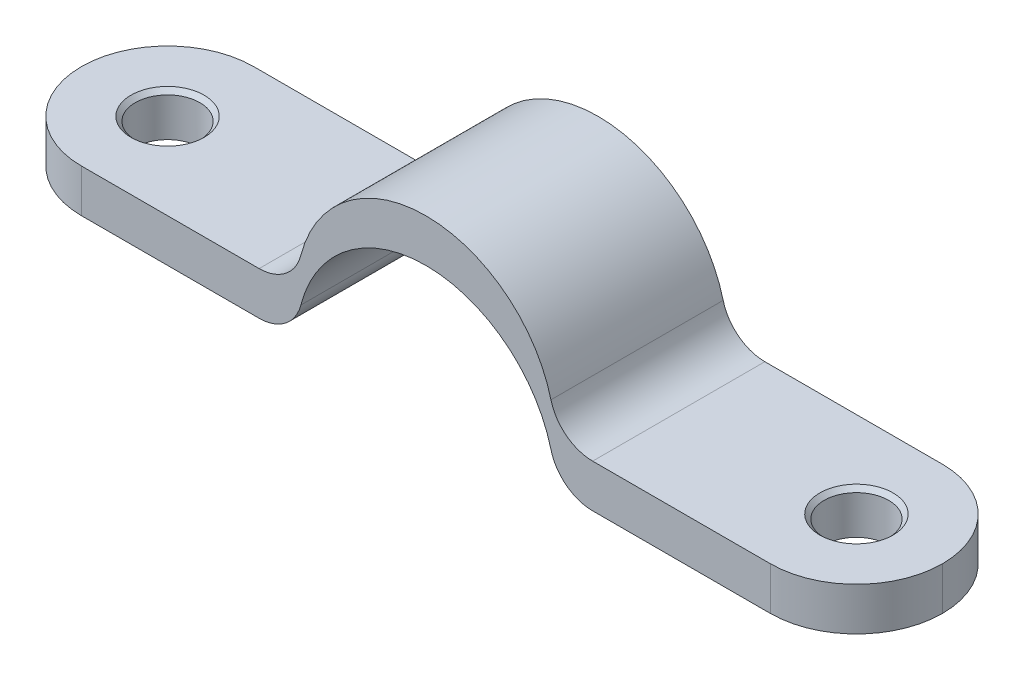
ISO-10303-21;
HEADER;
FILE_DESCRIPTION(('STEP AP214'),'2;1');
FILE_NAME('part.step','',(''),(''),'','','');
FILE_SCHEMA(('AUTOMOTIVE_DESIGN { 1 0 10303 214 1 1 1 1 }'));
ENDSEC;
DATA;
#1=APPLICATION_CONTEXT('core data for automotive mechanical design processes');
#2=APPLICATION_PROTOCOL_DEFINITION('international standard','automotive_design',2000,#1);
#3=PRODUCT_CONTEXT('',#1,'mechanical');
#4=PRODUCT('Part','Part','',(#3));
#5=PRODUCT_RELATED_PRODUCT_CATEGORY('part','',(#4));
#6=PRODUCT_DEFINITION_FORMATION('','',#4);
#7=PRODUCT_DEFINITION_CONTEXT('part definition',#1,'design');
#8=PRODUCT_DEFINITION('design','',#6,#7);
#9=PRODUCT_DEFINITION_SHAPE('','',#8);
#10=(LENGTH_UNIT() NAMED_UNIT(*) SI_UNIT(.MILLI.,.METRE.));
#11=(NAMED_UNIT(*) PLANE_ANGLE_UNIT() SI_UNIT($,.RADIAN.));
#12=(NAMED_UNIT(*) SI_UNIT($,.STERADIAN.) SOLID_ANGLE_UNIT());
#13=UNCERTAINTY_MEASURE_WITH_UNIT(LENGTH_MEASURE(1.E-05),#10,'distance_accuracy_value','');
#14=(GEOMETRIC_REPRESENTATION_CONTEXT(3) GLOBAL_UNCERTAINTY_ASSIGNED_CONTEXT((#13)) GLOBAL_UNIT_ASSIGNED_CONTEXT((#10,
#11,#12)) REPRESENTATION_CONTEXT('',''));
#15=CARTESIAN_POINT('',(0.,0.,0.));
#16=DIRECTION('',(0.,0.,1.));
#17=DIRECTION('',(1.,0.,0.));
#18=AXIS2_PLACEMENT_3D('',#15,#16,#17);
#19=CARTESIAN_POINT('',(-38.7298334620741,4.99999999999999,40.));
#20=DIRECTION('',(0.,-1.,0.));
#21=DIRECTION('',(1.,0.,0.));
#22=AXIS2_PLACEMENT_3D('',#19,#20,#21);
#23=PLANE('',#22);
#24=CARTESIAN_POINT('',(-80.,4.99999999999999,20.));
#25=DIRECTION('',(0.,-1.,0.));
#26=DIRECTION('',(1.,0.,0.));
#27=AXIS2_PLACEMENT_3D('',#24,#25,#26);
#28=CIRCLE('',#27,8.49999999999999);
#29=CARTESIAN_POINT('',(-71.5,4.99999999999999,20.));
#30=VERTEX_POINT('',#29);
#31=EDGE_CURVE('E11',#30,#30,#28,.T.);
#32=ORIENTED_EDGE('',*,*,#31,.T.);
#33=EDGE_LOOP('',(#32));
#34=FACE_BOUND('',#33,.T.);
#35=DIRECTION('',(-1.,0.,0.));
#36=VECTOR('',#35,1.);
#37=CARTESIAN_POINT('',(-38.7298334620741,4.99999999999999,0.));
#38=LINE('',#37,#36);
#39=CARTESIAN_POINT('',(-38.7298334620741,4.99999999999999,0.));
#40=VERTEX_POINT('',#39);
#41=CARTESIAN_POINT('',(-80.,4.99999999999999,0.));
#42=VERTEX_POINT('',#41);
#43=EDGE_CURVE('E179',#40,#42,#38,.T.);
#44=ORIENTED_EDGE('',*,*,#43,.T.);
#45=CARTESIAN_POINT('',(-80.,4.99999999999999,20.));
#46=DIRECTION('',(0.,-1.,0.));
#47=DIRECTION('',(1.,0.,0.));
#48=AXIS2_PLACEMENT_3D('',#45,#46,#47);
#49=CIRCLE('',#48,20.);
#50=CARTESIAN_POINT('',(-100.,4.99999999999999,20.));
#51=VERTEX_POINT('',#50);
#52=EDGE_CURVE('E51',#42,#51,#49,.F.);
#53=ORIENTED_EDGE('',*,*,#52,.T.);
#54=CARTESIAN_POINT('',(-80.,4.99999999999999,20.));
#55=DIRECTION('',(0.,-1.,0.));
#56=DIRECTION('',(1.,0.,0.));
#57=AXIS2_PLACEMENT_3D('',#54,#55,#56);
#58=CIRCLE('',#57,20.);
#59=CARTESIAN_POINT('',(-80.,4.99999999999999,40.));
#60=VERTEX_POINT('',#59);
#61=EDGE_CURVE('E237',#51,#60,#58,.F.);
#62=ORIENTED_EDGE('',*,*,#61,.T.);
#63=DIRECTION('',(-1.,0.,0.));
#64=VECTOR('',#63,1.);
#65=CARTESIAN_POINT('',(-38.7298334620741,4.99999999999999,40.));
#66=LINE('',#65,#64);
#67=CARTESIAN_POINT('',(-38.7298334620741,4.99999999999999,40.));
#68=VERTEX_POINT('',#67);
#69=EDGE_CURVE('E146',#68,#60,#66,.T.);
#70=ORIENTED_EDGE('',*,*,#69,.F.);
#71=DIRECTION('',(0.,0.,-1.));
#72=VECTOR('',#71,1.);
#73=CARTESIAN_POINT('',(-38.7298334620741,4.99999999999999,40.));
#74=LINE('',#73,#72);
#75=EDGE_CURVE('E178',#68,#40,#74,.T.);
#76=ORIENTED_EDGE('',*,*,#75,.T.);
#77=EDGE_LOOP('',(#44,#53,#62,#70,#76));
#78=FACE_BOUND('',#77,.T.);
#79=ADVANCED_FACE('F35',(#34,#78),#23,.F.);
#80=CARTESIAN_POINT('',(-38.7298334620741,-5.,40.));
#81=DIRECTION('',(0.,1.,0.));
#82=DIRECTION('',(-1.,0.,0.));
#83=AXIS2_PLACEMENT_3D('',#80,#81,#82);
#84=PLANE('',#83);
#85=CARTESIAN_POINT('',(-80.,-5.00000000000001,20.));
#86=DIRECTION('',(0.,1.,0.));
#87=DIRECTION('',(-1.,0.,0.));
#88=AXIS2_PLACEMENT_3D('',#85,#86,#87);
#89=CIRCLE('',#88,7.5);
#90=CARTESIAN_POINT('',(-87.5,-5.00000000000001,20.));
#91=VERTEX_POINT('',#90);
#92=EDGE_CURVE('E246',#91,#91,#89,.T.);
#93=ORIENTED_EDGE('',*,*,#92,.T.);
#94=EDGE_LOOP('',(#93));
#95=FACE_BOUND('',#94,.T.);
#96=CARTESIAN_POINT('',(-80.,-5.00000000000001,20.));
#97=DIRECTION('',(0.,1.,0.));
#98=DIRECTION('',(-1.,0.,0.));
#99=AXIS2_PLACEMENT_3D('',#96,#97,#98);
#100=CIRCLE('',#99,20.);
#101=CARTESIAN_POINT('',(-80.,-5.00000000000001,40.));
#102=VERTEX_POINT('',#101);
#103=CARTESIAN_POINT('',(-100.,-5.00000000000001,20.));
#104=VERTEX_POINT('',#103);
#105=EDGE_CURVE('E59',#102,#104,#100,.F.);
#106=ORIENTED_EDGE('',*,*,#105,.T.);
#107=CARTESIAN_POINT('',(-80.,-5.00000000000001,20.));
#108=DIRECTION('',(0.,1.,0.));
#109=DIRECTION('',(-1.,0.,0.));
#110=AXIS2_PLACEMENT_3D('',#107,#108,#109);
#111=CIRCLE('',#110,20.);
#112=CARTESIAN_POINT('',(-80.,-5.00000000000001,0.));
#113=VERTEX_POINT('',#112);
#114=EDGE_CURVE('E235',#104,#113,#111,.F.);
#115=ORIENTED_EDGE('',*,*,#114,.T.);
#116=DIRECTION('',(1.,0.,0.));
#117=VECTOR('',#116,1.);
#118=CARTESIAN_POINT('',(-38.7298334620741,-5.,0.));
#119=LINE('',#118,#117);
#120=CARTESIAN_POINT('',(-38.7298334620741,-5.,0.));
#121=VERTEX_POINT('',#120);
#122=EDGE_CURVE('E152',#113,#121,#119,.T.);
#123=ORIENTED_EDGE('',*,*,#122,.T.);
#124=DIRECTION('',(0.,0.,-1.));
#125=VECTOR('',#124,1.);
#126=CARTESIAN_POINT('',(-38.7298334620741,-5.,40.));
#127=LINE('',#126,#125);
#128=CARTESIAN_POINT('',(-38.7298334620741,-5.,40.));
#129=VERTEX_POINT('',#128);
#130=EDGE_CURVE('E149',#129,#121,#127,.T.);
#131=ORIENTED_EDGE('',*,*,#130,.F.);
#132=DIRECTION('',(1.,0.,0.));
#133=VECTOR('',#132,1.);
#134=CARTESIAN_POINT('',(-38.7298334620741,-5.,40.));
#135=LINE('',#134,#133);
#136=EDGE_CURVE('E136',#102,#129,#135,.T.);
#137=ORIENTED_EDGE('',*,*,#136,.F.);
#138=EDGE_LOOP('',(#106,#115,#123,#131,#137));
#139=FACE_BOUND('',#138,.T.);
#140=ADVANCED_FACE('F150',(#95,#139),#84,.F.);
#141=CARTESIAN_POINT('',(-38.7298334620741,4.99999999999999,40.));
#142=DIRECTION('',(0.,0.,-1.));
#143=DIRECTION('',(-1.,0.,0.));
#144=AXIS2_PLACEMENT_3D('',#141,#142,#143);
#145=CYLINDRICAL_SURFACE('',#144,10.);
#146=CARTESIAN_POINT('',(-38.7298334620741,4.99999999999999,0.));
#147=DIRECTION('',(0.,0.,1.));
#148=DIRECTION('',(-1.,0.,0.));
#149=AXIS2_PLACEMENT_3D('',#146,#147,#148);
#150=CIRCLE('',#149,10.);
#151=CARTESIAN_POINT('',(-29.0473750965556,2.5,0.));
#152=VERTEX_POINT('',#151);
#153=EDGE_CURVE('E183',#121,#152,#150,.T.);
#154=ORIENTED_EDGE('',*,*,#153,.T.);
#155=DIRECTION('',(0.,0.,-1.));
#156=VECTOR('',#155,1.);
#157=CARTESIAN_POINT('',(-29.0473750965556,2.5,40.));
#158=LINE('',#157,#156);
#159=CARTESIAN_POINT('',(-29.0473750965556,2.5,40.));
#160=VERTEX_POINT('',#159);
#161=EDGE_CURVE('E156',#160,#152,#158,.T.);
#162=ORIENTED_EDGE('',*,*,#161,.F.);
#163=CARTESIAN_POINT('',(-38.7298334620741,4.99999999999999,40.));
#164=DIRECTION('',(0.,0.,1.));
#165=DIRECTION('',(-1.,0.,0.));
#166=AXIS2_PLACEMENT_3D('',#163,#164,#165);
#167=CIRCLE('',#166,10.);
#168=EDGE_CURVE('E141',#129,#160,#167,.T.);
#169=ORIENTED_EDGE('',*,*,#168,.F.);
#170=ORIENTED_EDGE('',*,*,#130,.T.);
#171=EDGE_LOOP('',(#154,#162,#169,#170));
#172=FACE_BOUND('',#171,.T.);
#173=ADVANCED_FACE('F158',(#172),#145,.T.);
#174=CARTESIAN_POINT('',(0.,-5.,40.));
#175=DIRECTION('',(0.,0.,-1.));
#176=DIRECTION('',(-1.,0.,0.));
#177=AXIS2_PLACEMENT_3D('',#174,#175,#176);
#178=CYLINDRICAL_SURFACE('',#177,30.);
#179=CARTESIAN_POINT('',(0.,-5.,0.));
#180=DIRECTION('',(0.,0.,-1.));
#181=DIRECTION('',(1.,0.,0.));
#182=AXIS2_PLACEMENT_3D('',#179,#180,#181);
#183=CIRCLE('',#182,30.);
#184=CARTESIAN_POINT('',(29.0473750965556,2.50000000000002,0.));
#185=VERTEX_POINT('',#184);
#186=EDGE_CURVE('E185',#152,#185,#183,.T.);
#187=ORIENTED_EDGE('',*,*,#186,.T.);
#188=DIRECTION('',(0.,0.,-1.));
#189=VECTOR('',#188,1.);
#190=CARTESIAN_POINT('',(29.0473750965556,2.50000000000002,40.));
#191=LINE('',#190,#189);
#192=CARTESIAN_POINT('',(29.0473750965556,2.50000000000002,40.));
#193=VERTEX_POINT('',#192);
#194=EDGE_CURVE('E214',#193,#185,#191,.T.);
#195=ORIENTED_EDGE('',*,*,#194,.F.);
#196=CARTESIAN_POINT('',(0.,-5.,40.));
#197=DIRECTION('',(0.,0.,-1.));
#198=DIRECTION('',(1.,0.,0.));
#199=AXIS2_PLACEMENT_3D('',#196,#197,#198);
#200=CIRCLE('',#199,30.);
#201=EDGE_CURVE('E161',#160,#193,#200,.T.);
#202=ORIENTED_EDGE('',*,*,#201,.F.);
#203=ORIENTED_EDGE('',*,*,#161,.T.);
#204=EDGE_LOOP('',(#187,#195,#202,#203));
#205=FACE_BOUND('',#204,.T.);
#206=ADVANCED_FACE('F310',(#205),#178,.F.);
#207=CARTESIAN_POINT('',(38.7298334620742,5.00000000000002,40.));
#208=DIRECTION('',(0.,0.,-1.));
#209=DIRECTION('',(-1.,0.,0.));
#210=AXIS2_PLACEMENT_3D('',#207,#208,#209);
#211=CYLINDRICAL_SURFACE('',#210,10.);
#212=CARTESIAN_POINT('',(38.7298334620742,5.00000000000002,0.));
#213=DIRECTION('',(0.,0.,1.));
#214=DIRECTION('',(1.,0.,0.));
#215=AXIS2_PLACEMENT_3D('',#212,#213,#214);
#216=CIRCLE('',#215,10.);
#217=CARTESIAN_POINT('',(38.7298334620742,-4.99999999999998,0.));
#218=VERTEX_POINT('',#217);
#219=EDGE_CURVE('E187',#185,#218,#216,.T.);
#220=ORIENTED_EDGE('',*,*,#219,.T.);
#221=DIRECTION('',(0.,0.,-1.));
#222=VECTOR('',#221,1.);
#223=CARTESIAN_POINT('',(38.7298334620742,-4.99999999999998,40.));
#224=LINE('',#223,#222);
#225=CARTESIAN_POINT('',(38.7298334620742,-4.99999999999998,40.));
#226=VERTEX_POINT('',#225);
#227=EDGE_CURVE('E211',#226,#218,#224,.T.);
#228=ORIENTED_EDGE('',*,*,#227,.F.);
#229=CARTESIAN_POINT('',(38.7298334620742,5.00000000000002,40.));
#230=DIRECTION('',(0.,0.,1.));
#231=DIRECTION('',(1.,0.,0.));
#232=AXIS2_PLACEMENT_3D('',#229,#230,#231);
#233=CIRCLE('',#232,10.);
#234=EDGE_CURVE('E163',#193,#226,#233,.T.);
#235=ORIENTED_EDGE('',*,*,#234,.F.);
#236=ORIENTED_EDGE('',*,*,#194,.T.);
#237=EDGE_LOOP('',(#220,#228,#235,#236));
#238=FACE_BOUND('',#237,.T.);
#239=ADVANCED_FACE('F317',(#238),#211,.T.);
#240=CARTESIAN_POINT('',(38.7298334620742,-4.99999999999998,40.));
#241=DIRECTION('',(0.,1.,0.));
#242=DIRECTION('',(-1.,0.,0.));
#243=AXIS2_PLACEMENT_3D('',#240,#241,#242);
#244=PLANE('',#243);
#245=CARTESIAN_POINT('',(80.,-4.99999999999996,20.));
#246=DIRECTION('',(0.,1.,0.));
#247=DIRECTION('',(-1.,0.,0.));
#248=AXIS2_PLACEMENT_3D('',#245,#246,#247);
#249=CIRCLE('',#248,7.5);
#250=CARTESIAN_POINT('',(72.5,-4.99999999999996,20.));
#251=VERTEX_POINT('',#250);
#252=EDGE_CURVE('E249',#251,#251,#249,.T.);
#253=ORIENTED_EDGE('',*,*,#252,.T.);
#254=EDGE_LOOP('',(#253));
#255=FACE_BOUND('',#254,.T.);
#256=DIRECTION('',(1.,0.,0.));
#257=VECTOR('',#256,1.);
#258=CARTESIAN_POINT('',(38.7298334620742,-4.99999999999998,0.));
#259=LINE('',#258,#257);
#260=CARTESIAN_POINT('',(80.,-4.99999999999995,0.));
#261=VERTEX_POINT('',#260);
#262=EDGE_CURVE('E189',#218,#261,#259,.T.);
#263=ORIENTED_EDGE('',*,*,#262,.T.);
#264=CARTESIAN_POINT('',(80.,-4.99999999999995,20.));
#265=DIRECTION('',(0.,1.,0.));
#266=DIRECTION('',(-1.,0.,0.));
#267=AXIS2_PLACEMENT_3D('',#264,#265,#266);
#268=CIRCLE('',#267,20.);
#269=CARTESIAN_POINT('',(100.,-4.99999999999994,20.));
#270=VERTEX_POINT('',#269);
#271=EDGE_CURVE('E229',#261,#270,#268,.F.);
#272=ORIENTED_EDGE('',*,*,#271,.T.);
#273=CARTESIAN_POINT('',(80.,-4.99999999999995,20.));
#274=DIRECTION('',(0.,1.,0.));
#275=DIRECTION('',(-1.,0.,0.));
#276=AXIS2_PLACEMENT_3D('',#273,#274,#275);
#277=CIRCLE('',#276,20.);
#278=CARTESIAN_POINT('',(80.,-4.99999999999995,40.));
#279=VERTEX_POINT('',#278);
#280=EDGE_CURVE('E227',#270,#279,#277,.F.);
#281=ORIENTED_EDGE('',*,*,#280,.T.);
#282=DIRECTION('',(1.,0.,0.));
#283=VECTOR('',#282,1.);
#284=CARTESIAN_POINT('',(38.7298334620742,-4.99999999999998,40.));
#285=LINE('',#284,#283);
#286=EDGE_CURVE('E168',#226,#279,#285,.T.);
#287=ORIENTED_EDGE('',*,*,#286,.F.);
#288=ORIENTED_EDGE('',*,*,#227,.T.);
#289=EDGE_LOOP('',(#263,#272,#281,#287,#288));
#290=FACE_BOUND('',#289,.T.);
#291=ADVANCED_FACE('F320',(#255,#290),#244,.F.);
#292=CARTESIAN_POINT('',(38.7298334620742,5.00000000000002,40.));
#293=DIRECTION('',(0.,-1.,0.));
#294=DIRECTION('',(1.,0.,0.));
#295=AXIS2_PLACEMENT_3D('',#292,#293,#294);
#296=PLANE('',#295);
#297=CARTESIAN_POINT('',(80.,5.00000000000005,20.));
#298=DIRECTION('',(0.,-1.,0.));
#299=DIRECTION('',(1.,0.,0.));
#300=AXIS2_PLACEMENT_3D('',#297,#298,#299);
#301=CIRCLE('',#300,8.50000000000001);
#302=CARTESIAN_POINT('',(88.5,5.00000000000005,20.));
#303=VERTEX_POINT('',#302);
#304=EDGE_CURVE('E252',#303,#303,#301,.T.);
#305=ORIENTED_EDGE('',*,*,#304,.T.);
#306=EDGE_LOOP('',(#305));
#307=FACE_BOUND('',#306,.T.);
#308=CARTESIAN_POINT('',(80.,5.00000000000005,20.));
#309=DIRECTION('',(0.,-1.,0.));
#310=DIRECTION('',(1.,0.,0.));
#311=AXIS2_PLACEMENT_3D('',#308,#309,#310);
#312=CIRCLE('',#311,20.);
#313=CARTESIAN_POINT('',(80.,5.00000000000005,40.));
#314=VERTEX_POINT('',#313);
#315=CARTESIAN_POINT('',(100.,5.00000000000006,20.));
#316=VERTEX_POINT('',#315);
#317=EDGE_CURVE('E155',#314,#316,#312,.F.);
#318=ORIENTED_EDGE('',*,*,#317,.T.);
#319=CARTESIAN_POINT('',(80.,5.00000000000005,20.));
#320=DIRECTION('',(0.,-1.,0.));
#321=DIRECTION('',(1.,0.,0.));
#322=AXIS2_PLACEMENT_3D('',#319,#320,#321);
#323=CIRCLE('',#322,20.);
#324=CARTESIAN_POINT('',(80.,5.00000000000005,0.));
#325=VERTEX_POINT('',#324);
#326=EDGE_CURVE('E219',#316,#325,#323,.F.);
#327=ORIENTED_EDGE('',*,*,#326,.T.);
#328=DIRECTION('',(-1.,0.,0.));
#329=VECTOR('',#328,1.);
#330=CARTESIAN_POINT('',(38.7298334620742,5.00000000000002,0.));
#331=LINE('',#330,#329);
#332=CARTESIAN_POINT('',(38.7298334620742,5.00000000000002,0.));
#333=VERTEX_POINT('',#332);
#334=EDGE_CURVE('E192',#325,#333,#331,.T.);
#335=ORIENTED_EDGE('',*,*,#334,.T.);
#336=DIRECTION('',(0.,0.,-1.));
#337=VECTOR('',#336,1.);
#338=CARTESIAN_POINT('',(38.7298334620742,5.00000000000002,40.));
#339=LINE('',#338,#337);
#340=CARTESIAN_POINT('',(38.7298334620742,5.00000000000002,40.));
#341=VERTEX_POINT('',#340);
#342=EDGE_CURVE('E208',#341,#333,#339,.T.);
#343=ORIENTED_EDGE('',*,*,#342,.F.);
#344=DIRECTION('',(-1.,0.,0.));
#345=VECTOR('',#344,1.);
#346=CARTESIAN_POINT('',(38.7298334620742,5.00000000000002,40.));
#347=LINE('',#346,#345);
#348=EDGE_CURVE('E170',#314,#341,#347,.T.);
#349=ORIENTED_EDGE('',*,*,#348,.F.);
#350=EDGE_LOOP('',(#318,#327,#335,#343,#349));
#351=FACE_BOUND('',#350,.T.);
#352=ADVANCED_FACE('F327',(#307,#351),#296,.F.);
#353=CARTESIAN_POINT('',(38.7298334620742,15.,40.));
#354=DIRECTION('',(0.,0.,-1.));
#355=DIRECTION('',(-1.,0.,0.));
#356=AXIS2_PLACEMENT_3D('',#353,#354,#355);
#357=CYLINDRICAL_SURFACE('',#356,10.);
#358=CARTESIAN_POINT('',(38.7298334620742,15.,0.));
#359=DIRECTION('',(0.,0.,-1.));
#360=DIRECTION('',(-1.,0.,0.));
#361=AXIS2_PLACEMENT_3D('',#358,#359,#360);
#362=CIRCLE('',#361,10.);
#363=CARTESIAN_POINT('',(29.0473750965556,12.5,0.));
#364=VERTEX_POINT('',#363);
#365=EDGE_CURVE('E194',#333,#364,#362,.T.);
#366=ORIENTED_EDGE('',*,*,#365,.T.);
#367=DIRECTION('',(0.,0.,-1.));
#368=VECTOR('',#367,1.);
#369=CARTESIAN_POINT('',(29.0473750965556,12.5,40.));
#370=LINE('',#369,#368);
#371=CARTESIAN_POINT('',(29.0473750965556,12.5,40.));
#372=VERTEX_POINT('',#371);
#373=EDGE_CURVE('E205',#372,#364,#370,.T.);
#374=ORIENTED_EDGE('',*,*,#373,.F.);
#375=CARTESIAN_POINT('',(38.7298334620742,15.,40.));
#376=DIRECTION('',(0.,0.,-1.));
#377=DIRECTION('',(-1.,0.,0.));
#378=AXIS2_PLACEMENT_3D('',#375,#376,#377);
#379=CIRCLE('',#378,10.);
#380=EDGE_CURVE('E172',#341,#372,#379,.T.);
#381=ORIENTED_EDGE('',*,*,#380,.F.);
#382=ORIENTED_EDGE('',*,*,#342,.T.);
#383=EDGE_LOOP('',(#366,#374,#381,#382));
#384=FACE_BOUND('',#383,.T.);
#385=ADVANCED_FACE('F335',(#384),#357,.F.);
#386=CARTESIAN_POINT('',(0.,5.,40.));
#387=DIRECTION('',(0.,0.,-1.));
#388=DIRECTION('',(-1.,0.,0.));
#389=AXIS2_PLACEMENT_3D('',#386,#387,#388);
#390=CYLINDRICAL_SURFACE('',#389,30.);
#391=CARTESIAN_POINT('',(0.,5.,0.));
#392=DIRECTION('',(0.,0.,1.));
#393=DIRECTION('',(1.,0.,0.));
#394=AXIS2_PLACEMENT_3D('',#391,#392,#393);
#395=CIRCLE('',#394,30.);
#396=CARTESIAN_POINT('',(-29.0473750965556,12.5,0.));
#397=VERTEX_POINT('',#396);
#398=EDGE_CURVE('E196',#364,#397,#395,.T.);
#399=ORIENTED_EDGE('',*,*,#398,.T.);
#400=DIRECTION('',(0.,0.,-1.));
#401=VECTOR('',#400,1.);
#402=CARTESIAN_POINT('',(-29.0473750965556,12.5,40.));
#403=LINE('',#402,#401);
#404=CARTESIAN_POINT('',(-29.0473750965556,12.5,40.));
#405=VERTEX_POINT('',#404);
#406=EDGE_CURVE('E202',#405,#397,#403,.T.);
#407=ORIENTED_EDGE('',*,*,#406,.F.);
#408=CARTESIAN_POINT('',(0.,5.,40.));
#409=DIRECTION('',(0.,0.,1.));
#410=DIRECTION('',(1.,0.,0.));
#411=AXIS2_PLACEMENT_3D('',#408,#409,#410);
#412=CIRCLE('',#411,30.);
#413=EDGE_CURVE('E174',#372,#405,#412,.T.);
#414=ORIENTED_EDGE('',*,*,#413,.F.);
#415=ORIENTED_EDGE('',*,*,#373,.T.);
#416=EDGE_LOOP('',(#399,#407,#414,#415));
#417=FACE_BOUND('',#416,.T.);
#418=ADVANCED_FACE('F339',(#417),#390,.T.);
#419=CARTESIAN_POINT('',(-38.7298334620741,15.,40.));
#420=DIRECTION('',(0.,0.,-1.));
#421=DIRECTION('',(-1.,0.,0.));
#422=AXIS2_PLACEMENT_3D('',#419,#420,#421);
#423=CYLINDRICAL_SURFACE('',#422,10.);
#424=CARTESIAN_POINT('',(-38.7298334620741,15.,0.));
#425=DIRECTION('',(0.,0.,-1.));
#426=DIRECTION('',(1.,0.,0.));
#427=AXIS2_PLACEMENT_3D('',#424,#425,#426);
#428=CIRCLE('',#427,10.);
#429=EDGE_CURVE('E198',#397,#40,#428,.T.);
#430=ORIENTED_EDGE('',*,*,#429,.T.);
#431=ORIENTED_EDGE('',*,*,#75,.F.);
#432=CARTESIAN_POINT('',(-38.7298334620741,15.,40.));
#433=DIRECTION('',(0.,0.,-1.));
#434=DIRECTION('',(1.,0.,0.));
#435=AXIS2_PLACEMENT_3D('',#432,#433,#434);
#436=CIRCLE('',#435,10.);
#437=EDGE_CURVE('E176',#405,#68,#436,.T.);
#438=ORIENTED_EDGE('',*,*,#437,.F.);
#439=ORIENTED_EDGE('',*,*,#406,.T.);
#440=EDGE_LOOP('',(#430,#431,#438,#439));
#441=FACE_BOUND('',#440,.T.);
#442=ADVANCED_FACE('F345',(#441),#423,.F.);
#443=CARTESIAN_POINT('',(-38.7298334620741,4.99999999999999,40.));
#444=DIRECTION('',(0.,0.,-1.));
#445=DIRECTION('',(-1.,0.,0.));
#446=AXIS2_PLACEMENT_3D('',#443,#444,#445);
#447=PLANE('',#446);
#448=ORIENTED_EDGE('',*,*,#286,.T.);
#449=DIRECTION('',(0.,1.,0.));
#450=VECTOR('',#449,1.);
#451=CARTESIAN_POINT('',(80.,4.99999999999999,40.));
#452=LINE('',#451,#450);
#453=EDGE_CURVE('E232',#279,#314,#452,.T.);
#454=ORIENTED_EDGE('',*,*,#453,.T.);
#455=ORIENTED_EDGE('',*,*,#348,.T.);
#456=ORIENTED_EDGE('',*,*,#380,.T.);
#457=ORIENTED_EDGE('',*,*,#413,.T.);
#458=ORIENTED_EDGE('',*,*,#437,.T.);
#459=ORIENTED_EDGE('',*,*,#69,.T.);
#460=DIRECTION('',(0.,-1.,0.));
#461=VECTOR('',#460,1.);
#462=CARTESIAN_POINT('',(-80.,4.99999999999999,40.));
#463=LINE('',#462,#461);
#464=EDGE_CURVE('E145',#60,#102,#463,.T.);
#465=ORIENTED_EDGE('',*,*,#464,.T.);
#466=ORIENTED_EDGE('',*,*,#136,.T.);
#467=ORIENTED_EDGE('',*,*,#168,.T.);
#468=ORIENTED_EDGE('',*,*,#201,.T.);
#469=ORIENTED_EDGE('',*,*,#234,.T.);
#470=EDGE_LOOP('',(#448,#454,#455,#456,#457,#458,#459,#465,#466,#467,#468,#469));
#471=FACE_BOUND('',#470,.T.);
#472=ADVANCED_FACE('F139',(#471),#447,.F.);
#473=CARTESIAN_POINT('',(-38.7298334620741,4.99999999999999,0.));
#474=DIRECTION('',(0.,0.,-1.));
#475=DIRECTION('',(-1.,0.,0.));
#476=AXIS2_PLACEMENT_3D('',#473,#474,#475);
#477=PLANE('',#476);
#478=ORIENTED_EDGE('',*,*,#334,.F.);
#479=DIRECTION('',(0.,1.,0.));
#480=VECTOR('',#479,1.);
#481=CARTESIAN_POINT('',(80.,-4.99999999999994,0.));
#482=LINE('',#481,#480);
#483=EDGE_CURVE('E224',#325,#261,#482,.F.);
#484=ORIENTED_EDGE('',*,*,#483,.T.);
#485=ORIENTED_EDGE('',*,*,#262,.F.);
#486=ORIENTED_EDGE('',*,*,#219,.F.);
#487=ORIENTED_EDGE('',*,*,#186,.F.);
#488=ORIENTED_EDGE('',*,*,#153,.F.);
#489=ORIENTED_EDGE('',*,*,#122,.F.);
#490=DIRECTION('',(0.,-1.,0.));
#491=VECTOR('',#490,1.);
#492=CARTESIAN_POINT('',(-80.,4.99999999999999,0.));
#493=LINE('',#492,#491);
#494=EDGE_CURVE('E221',#113,#42,#493,.F.);
#495=ORIENTED_EDGE('',*,*,#494,.T.);
#496=ORIENTED_EDGE('',*,*,#43,.F.);
#497=ORIENTED_EDGE('',*,*,#429,.F.);
#498=ORIENTED_EDGE('',*,*,#398,.F.);
#499=ORIENTED_EDGE('',*,*,#365,.F.);
#500=EDGE_LOOP('',(#478,#484,#485,#486,#487,#488,#489,#495,#496,#497,#498,#499));
#501=FACE_BOUND('',#500,.T.);
#502=ADVANCED_FACE('F286',(#501),#477,.T.);
#503=CARTESIAN_POINT('',(80.,4.99999999999999,20.));
#504=DIRECTION('',(0.,1.,0.));
#505=DIRECTION('',(0.,0.,1.));
#506=AXIS2_PLACEMENT_3D('',#503,#504,#505);
#507=CYLINDRICAL_SURFACE('',#506,20.);
#508=ORIENTED_EDGE('',*,*,#453,.F.);
#509=ORIENTED_EDGE('',*,*,#280,.F.);
#510=DIRECTION('',(0.,1.,0.));
#511=VECTOR('',#510,1.);
#512=CARTESIAN_POINT('',(100.,-4.99999999999994,20.));
#513=LINE('',#512,#511);
#514=EDGE_CURVE('E181',#316,#270,#513,.F.);
#515=ORIENTED_EDGE('',*,*,#514,.F.);
#516=ORIENTED_EDGE('',*,*,#317,.F.);
#517=EDGE_LOOP('',(#508,#509,#515,#516));
#518=FACE_BOUND('',#517,.T.);
#519=ADVANCED_FACE('F282',(#518),#507,.T.);
#520=CARTESIAN_POINT('',(80.,-4.99999999999994,20.));
#521=DIRECTION('',(0.,-1.,0.));
#522=DIRECTION('',(0.,0.,-1.));
#523=AXIS2_PLACEMENT_3D('',#520,#521,#522);
#524=CYLINDRICAL_SURFACE('',#523,20.);
#525=ORIENTED_EDGE('',*,*,#271,.F.);
#526=ORIENTED_EDGE('',*,*,#483,.F.);
#527=ORIENTED_EDGE('',*,*,#326,.F.);
#528=ORIENTED_EDGE('',*,*,#514,.T.);
#529=EDGE_LOOP('',(#525,#526,#527,#528));
#530=FACE_BOUND('',#529,.T.);
#531=ADVANCED_FACE('F278',(#530),#524,.T.);
#532=CARTESIAN_POINT('',(-80.,4.99999999999999,20.));
#533=DIRECTION('',(0.,-1.,0.));
#534=DIRECTION('',(0.,0.,-1.));
#535=AXIS2_PLACEMENT_3D('',#532,#533,#534);
#536=CYLINDRICAL_SURFACE('',#535,20.);
#537=ORIENTED_EDGE('',*,*,#464,.F.);
#538=ORIENTED_EDGE('',*,*,#61,.F.);
#539=DIRECTION('',(0.,-1.,0.));
#540=VECTOR('',#539,1.);
#541=CARTESIAN_POINT('',(-100.,-5.00000000000001,20.));
#542=LINE('',#541,#540);
#543=EDGE_CURVE('E243',#104,#51,#542,.F.);
#544=ORIENTED_EDGE('',*,*,#543,.F.);
#545=ORIENTED_EDGE('',*,*,#105,.F.);
#546=EDGE_LOOP('',(#537,#538,#544,#545));
#547=FACE_BOUND('',#546,.T.);
#548=ADVANCED_FACE('F281',(#547),#536,.T.);
#549=CARTESIAN_POINT('',(-80.,-5.00000000000001,20.));
#550=DIRECTION('',(0.,1.,0.));
#551=DIRECTION('',(0.,0.,1.));
#552=AXIS2_PLACEMENT_3D('',#549,#550,#551);
#553=CYLINDRICAL_SURFACE('',#552,20.);
#554=ORIENTED_EDGE('',*,*,#52,.F.);
#555=ORIENTED_EDGE('',*,*,#494,.F.);
#556=ORIENTED_EDGE('',*,*,#114,.F.);
#557=ORIENTED_EDGE('',*,*,#543,.T.);
#558=EDGE_LOOP('',(#554,#555,#556,#557));
#559=FACE_BOUND('',#558,.T.);
#560=ADVANCED_FACE('F288',(#559),#553,.T.);
#561=CARTESIAN_POINT('',(80.,-35.,20.));
#562=DIRECTION('',(0.,1.,0.));
#563=DIRECTION('',(-1.,0.,0.));
#564=AXIS2_PLACEMENT_3D('',#561,#562,#563);
#565=CYLINDRICAL_SURFACE('',#564,7.5);
#566=CARTESIAN_POINT('',(80.,4.00000000000004,20.));
#567=DIRECTION('',(0.,-1.,0.));
#568=DIRECTION('',(0.,0.,-1.));
#569=AXIS2_PLACEMENT_3D('',#566,#567,#568);
#570=CIRCLE('',#569,7.5);
#571=CARTESIAN_POINT('',(80.,4.00000000000004,12.5));
#572=VERTEX_POINT('',#571);
#573=EDGE_CURVE('E240',#572,#572,#570,.F.);
#574=ORIENTED_EDGE('',*,*,#573,.T.);
#575=EDGE_LOOP('',(#574));
#576=FACE_BOUND('',#575,.T.);
#577=ORIENTED_EDGE('',*,*,#252,.F.);
#578=EDGE_LOOP('',(#577));
#579=FACE_BOUND('',#578,.T.);
#580=ADVANCED_FACE('F291',(#576,#579),#565,.F.);
#581=CARTESIAN_POINT('',(-79.9999999999999,-35.,20.));
#582=DIRECTION('',(0.,1.,0.));
#583=DIRECTION('',(-1.,0.,0.));
#584=AXIS2_PLACEMENT_3D('',#581,#582,#583);
#585=CYLINDRICAL_SURFACE('',#584,7.5);
#586=CARTESIAN_POINT('',(-80.,4.,20.));
#587=DIRECTION('',(0.,-1.,0.));
#588=DIRECTION('',(0.,0.,-1.));
#589=AXIS2_PLACEMENT_3D('',#586,#587,#588);
#590=CIRCLE('',#589,7.5);
#591=CARTESIAN_POINT('',(-80.,4.,12.5));
#592=VERTEX_POINT('',#591);
#593=EDGE_CURVE('E44',#592,#592,#590,.F.);
#594=ORIENTED_EDGE('',*,*,#593,.T.);
#595=EDGE_LOOP('',(#594));
#596=FACE_BOUND('',#595,.T.);
#597=ORIENTED_EDGE('',*,*,#92,.F.);
#598=EDGE_LOOP('',(#597));
#599=FACE_BOUND('',#598,.T.);
#600=ADVANCED_FACE('F257',(#596,#599),#585,.F.);
#601=CARTESIAN_POINT('',(80.,4.00000000000005,20.));
#602=DIRECTION('',(0.,1.,0.));
#603=DIRECTION('',(0.,0.,1.));
#604=AXIS2_PLACEMENT_3D('',#601,#602,#603);
#605=CONICAL_SURFACE('',#604,7.5,0.785398163397457);
#606=ORIENTED_EDGE('',*,*,#304,.F.);
#607=EDGE_LOOP('',(#606));
#608=FACE_BOUND('',#607,.T.);
#609=ORIENTED_EDGE('',*,*,#573,.F.);
#610=EDGE_LOOP('',(#609));
#611=FACE_BOUND('',#610,.T.);
#612=ADVANCED_FACE('F261',(#608,#611),#605,.F.);
#613=CARTESIAN_POINT('',(-80.,4.,20.));
#614=DIRECTION('',(0.,1.,0.));
#615=DIRECTION('',(0.,0.,1.));
#616=AXIS2_PLACEMENT_3D('',#613,#614,#615);
#617=CONICAL_SURFACE('',#616,7.5,0.78539816339745);
#618=ORIENTED_EDGE('',*,*,#31,.F.);
#619=EDGE_LOOP('',(#618));
#620=FACE_BOUND('',#619,.T.);
#621=ORIENTED_EDGE('',*,*,#593,.F.);
#622=EDGE_LOOP('',(#621));
#623=FACE_BOUND('',#622,.T.);
#624=ADVANCED_FACE('F38',(#620,#623),#617,.F.);
#625=CLOSED_SHELL('',(#79,#140,#173,#206,#239,#291,#352,#385,#418,#442,#472,#502,#519,#531,#548,
#560,#580,#600,#612,#624));
#626=MANIFOLD_SOLID_BREP('B2',#625);
#627=ADVANCED_BREP_SHAPE_REPRESENTATION('',(#18,#626),#14);
#628=SHAPE_DEFINITION_REPRESENTATION(#9,#627);
ENDSEC;
END-ISO-10303-21;
